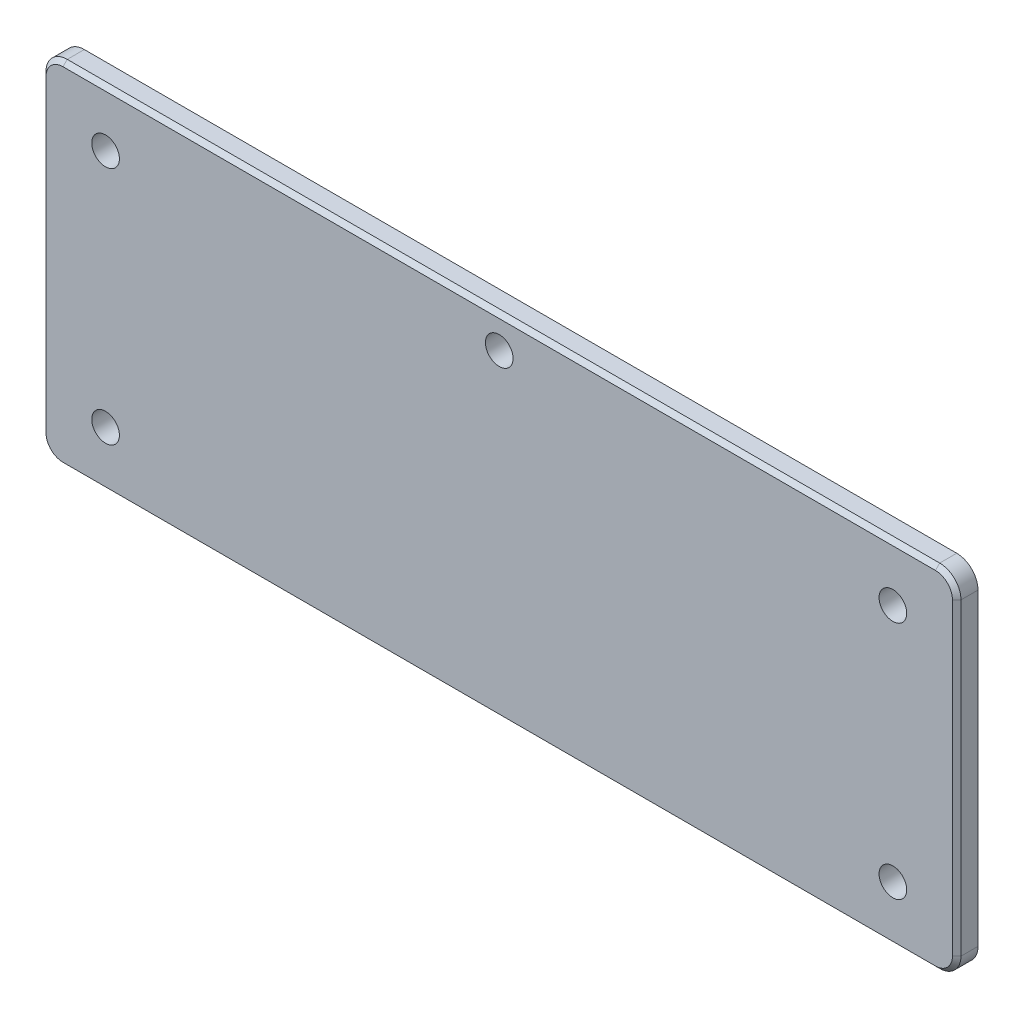
ISO-10303-21;
HEADER;
FILE_DESCRIPTION(('STEP AP214'),'2;1');
FILE_NAME('part.step','',(''),(''),'','','');
FILE_SCHEMA(('AUTOMOTIVE_DESIGN { 1 0 10303 214 1 1 1 1 }'));
ENDSEC;
DATA;
#1=APPLICATION_CONTEXT('core data for automotive mechanical design processes');
#2=APPLICATION_PROTOCOL_DEFINITION('international standard','automotive_design',2000,#1);
#3=PRODUCT_CONTEXT('',#1,'mechanical');
#4=PRODUCT('Part','Part','',(#3));
#5=PRODUCT_RELATED_PRODUCT_CATEGORY('part','',(#4));
#6=PRODUCT_DEFINITION_FORMATION('','',#4);
#7=PRODUCT_DEFINITION_CONTEXT('part definition',#1,'design');
#8=PRODUCT_DEFINITION('design','',#6,#7);
#9=PRODUCT_DEFINITION_SHAPE('','',#8);
#10=(LENGTH_UNIT() NAMED_UNIT(*) SI_UNIT(.MILLI.,.METRE.));
#11=(NAMED_UNIT(*) PLANE_ANGLE_UNIT() SI_UNIT($,.RADIAN.));
#12=(NAMED_UNIT(*) SI_UNIT($,.STERADIAN.) SOLID_ANGLE_UNIT());
#13=UNCERTAINTY_MEASURE_WITH_UNIT(LENGTH_MEASURE(1.E-05),#10,'distance_accuracy_value','');
#14=(GEOMETRIC_REPRESENTATION_CONTEXT(3) GLOBAL_UNCERTAINTY_ASSIGNED_CONTEXT((#13)) GLOBAL_UNIT_ASSIGNED_CONTEXT((#10,
#11,#12)) REPRESENTATION_CONTEXT('',''));
#15=CARTESIAN_POINT('',(0.,0.,0.));
#16=DIRECTION('',(0.,0.,1.));
#17=DIRECTION('',(1.,0.,0.));
#18=AXIS2_PLACEMENT_3D('',#15,#16,#17);
#19=CARTESIAN_POINT('',(-54.61,20.955,2.54));
#20=DIRECTION('',(1.,0.,0.));
#21=DIRECTION('',(0.,1.,0.));
#22=AXIS2_PLACEMENT_3D('',#19,#20,#21);
#23=PLANE('',#22);
#24=DIRECTION('',(0.,0.,-1.));
#25=VECTOR('',#24,1.);
#26=CARTESIAN_POINT('',(-54.61,-18.415,2.54));
#27=LINE('',#26,#25);
#28=CARTESIAN_POINT('',(-54.61,-18.415,0.));
#29=VERTEX_POINT('',#28);
#30=CARTESIAN_POINT('',(-54.61,-18.415,2.03200000000001));
#31=VERTEX_POINT('',#30);
#32=EDGE_CURVE('E172',#29,#31,#27,.F.);
#33=ORIENTED_EDGE('',*,*,#32,.T.);
#34=DIRECTION('',(0.,1.,0.));
#35=VECTOR('',#34,1.);
#36=CARTESIAN_POINT('',(-54.61,18.415,2.03200000000001));
#37=LINE('',#36,#35);
#38=CARTESIAN_POINT('',(-54.61,18.415,2.03200000000001));
#39=VERTEX_POINT('',#38);
#40=EDGE_CURVE('E11',#31,#39,#37,.T.);
#41=ORIENTED_EDGE('',*,*,#40,.T.);
#42=DIRECTION('',(0.,0.,-1.));
#43=VECTOR('',#42,1.);
#44=CARTESIAN_POINT('',(-54.61,18.415,2.54));
#45=LINE('',#44,#43);
#46=CARTESIAN_POINT('',(-54.61,18.415,0.));
#47=VERTEX_POINT('',#46);
#48=EDGE_CURVE('E170',#39,#47,#45,.T.);
#49=ORIENTED_EDGE('',*,*,#48,.T.);
#50=DIRECTION('',(0.,-1.,0.));
#51=VECTOR('',#50,1.);
#52=CARTESIAN_POINT('',(-54.61,20.955,0.));
#53=LINE('',#52,#51);
#54=EDGE_CURVE('E262',#47,#29,#53,.T.);
#55=ORIENTED_EDGE('',*,*,#54,.T.);
#56=EDGE_LOOP('',(#33,#41,#49,#55));
#57=FACE_BOUND('',#56,.T.);
#58=ADVANCED_FACE('F34',(#57),#23,.F.);
#59=CARTESIAN_POINT('',(-54.61,-20.955,2.54));
#60=DIRECTION('',(0.,1.,0.));
#61=DIRECTION('',(0.,0.,1.));
#62=AXIS2_PLACEMENT_3D('',#59,#60,#61);
#63=PLANE('',#62);
#64=DIRECTION('',(0.,0.,-1.));
#65=VECTOR('',#64,1.);
#66=CARTESIAN_POINT('',(52.07,-20.955,2.54));
#67=LINE('',#66,#65);
#68=CARTESIAN_POINT('',(52.07,-20.955,0.));
#69=VERTEX_POINT('',#68);
#70=CARTESIAN_POINT('',(52.07,-20.955,2.03200000000001));
#71=VERTEX_POINT('',#70);
#72=EDGE_CURVE('E167',#69,#71,#67,.F.);
#73=ORIENTED_EDGE('',*,*,#72,.T.);
#74=DIRECTION('',(-1.,0.,0.));
#75=VECTOR('',#74,1.);
#76=CARTESIAN_POINT('',(-52.07,-20.955,2.03200000000001));
#77=LINE('',#76,#75);
#78=CARTESIAN_POINT('',(-52.07,-20.955,2.03200000000001));
#79=VERTEX_POINT('',#78);
#80=EDGE_CURVE('E199',#71,#79,#77,.T.);
#81=ORIENTED_EDGE('',*,*,#80,.T.);
#82=DIRECTION('',(0.,0.,-1.));
#83=VECTOR('',#82,1.);
#84=CARTESIAN_POINT('',(-52.07,-20.955,2.54));
#85=LINE('',#84,#83);
#86=CARTESIAN_POINT('',(-52.07,-20.955,0.));
#87=VERTEX_POINT('',#86);
#88=EDGE_CURVE('E165',#79,#87,#85,.T.);
#89=ORIENTED_EDGE('',*,*,#88,.T.);
#90=DIRECTION('',(1.,0.,0.));
#91=VECTOR('',#90,1.);
#92=CARTESIAN_POINT('',(-54.61,-20.955,0.));
#93=LINE('',#92,#91);
#94=EDGE_CURVE('E155',#87,#69,#93,.T.);
#95=ORIENTED_EDGE('',*,*,#94,.T.);
#96=EDGE_LOOP('',(#73,#81,#89,#95));
#97=FACE_BOUND('',#96,.T.);
#98=ADVANCED_FACE('F268',(#97),#63,.F.);
#99=CARTESIAN_POINT('',(54.61,20.955,2.54));
#100=DIRECTION('',(-1.,0.,0.));
#101=DIRECTION('',(0.,0.,1.));
#102=AXIS2_PLACEMENT_3D('',#99,#100,#101);
#103=PLANE('',#102);
#104=DIRECTION('',(0.,0.,-1.));
#105=VECTOR('',#104,1.);
#106=CARTESIAN_POINT('',(54.61,18.415,2.54));
#107=LINE('',#106,#105);
#108=CARTESIAN_POINT('',(54.61,18.415,0.));
#109=VERTEX_POINT('',#108);
#110=CARTESIAN_POINT('',(54.61,18.415,2.03200000000001));
#111=VERTEX_POINT('',#110);
#112=EDGE_CURVE('E142',#109,#111,#107,.F.);
#113=ORIENTED_EDGE('',*,*,#112,.T.);
#114=DIRECTION('',(0.,-1.,0.));
#115=VECTOR('',#114,1.);
#116=CARTESIAN_POINT('',(54.61,-18.415,2.03200000000001));
#117=LINE('',#116,#115);
#118=CARTESIAN_POINT('',(54.61,-18.415,2.03200000000001));
#119=VERTEX_POINT('',#118);
#120=EDGE_CURVE('E191',#111,#119,#117,.T.);
#121=ORIENTED_EDGE('',*,*,#120,.T.);
#122=DIRECTION('',(0.,0.,-1.));
#123=VECTOR('',#122,1.);
#124=CARTESIAN_POINT('',(54.61,-18.415,2.54));
#125=LINE('',#124,#123);
#126=CARTESIAN_POINT('',(54.61,-18.415,0.));
#127=VERTEX_POINT('',#126);
#128=EDGE_CURVE('E146',#119,#127,#125,.T.);
#129=ORIENTED_EDGE('',*,*,#128,.T.);
#130=DIRECTION('',(0.,1.,0.));
#131=VECTOR('',#130,1.);
#132=CARTESIAN_POINT('',(54.61,20.955,0.));
#133=LINE('',#132,#131);
#134=EDGE_CURVE('E152',#127,#109,#133,.T.);
#135=ORIENTED_EDGE('',*,*,#134,.T.);
#136=EDGE_LOOP('',(#113,#121,#129,#135));
#137=FACE_BOUND('',#136,.T.);
#138=ADVANCED_FACE('F284',(#137),#103,.F.);
#139=CARTESIAN_POINT('',(-54.61,20.955,2.54));
#140=DIRECTION('',(0.,-1.,0.));
#141=DIRECTION('',(0.,0.,-1.));
#142=AXIS2_PLACEMENT_3D('',#139,#140,#141);
#143=PLANE('',#142);
#144=DIRECTION('',(0.,0.,-1.));
#145=VECTOR('',#144,1.);
#146=CARTESIAN_POINT('',(-52.07,20.955,2.54));
#147=LINE('',#146,#145);
#148=CARTESIAN_POINT('',(-52.07,20.955,0.));
#149=VERTEX_POINT('',#148);
#150=CARTESIAN_POINT('',(-52.07,20.955,2.03200000000001));
#151=VERTEX_POINT('',#150);
#152=EDGE_CURVE('E136',#149,#151,#147,.F.);
#153=ORIENTED_EDGE('',*,*,#152,.T.);
#154=DIRECTION('',(1.,0.,0.));
#155=VECTOR('',#154,1.);
#156=CARTESIAN_POINT('',(52.07,20.955,2.03200000000001));
#157=LINE('',#156,#155);
#158=CARTESIAN_POINT('',(52.07,20.955,2.03200000000001));
#159=VERTEX_POINT('',#158);
#160=EDGE_CURVE('E132',#151,#159,#157,.T.);
#161=ORIENTED_EDGE('',*,*,#160,.T.);
#162=DIRECTION('',(0.,0.,-1.));
#163=VECTOR('',#162,1.);
#164=CARTESIAN_POINT('',(52.07,20.955,2.54));
#165=LINE('',#164,#163);
#166=CARTESIAN_POINT('',(52.07,20.955,0.));
#167=VERTEX_POINT('',#166);
#168=EDGE_CURVE('E124',#159,#167,#165,.T.);
#169=ORIENTED_EDGE('',*,*,#168,.T.);
#170=DIRECTION('',(-1.,0.,0.));
#171=VECTOR('',#170,1.);
#172=CARTESIAN_POINT('',(-54.61,20.955,0.));
#173=LINE('',#172,#171);
#174=EDGE_CURVE('E129',#167,#149,#173,.T.);
#175=ORIENTED_EDGE('',*,*,#174,.T.);
#176=EDGE_LOOP('',(#153,#161,#169,#175));
#177=FACE_BOUND('',#176,.T.);
#178=ADVANCED_FACE('F127',(#177),#143,.F.);
#179=CARTESIAN_POINT('',(0.,0.,2.54));
#180=DIRECTION('',(0.,0.,1.));
#181=DIRECTION('',(1.,0.,0.));
#182=AXIS2_PLACEMENT_3D('',#179,#180,#181);
#183=PLANE('',#182);
#184=CARTESIAN_POINT('',(52.07,-18.415,2.54));
#185=DIRECTION('',(0.,0.,1.));
#186=DIRECTION('',(1.,0.,0.));
#187=AXIS2_PLACEMENT_3D('',#184,#185,#186);
#188=CIRCLE('',#187,2.03199999999999);
#189=CARTESIAN_POINT('',(52.07,-20.447,2.54));
#190=VERTEX_POINT('',#189);
#191=CARTESIAN_POINT('',(54.102,-18.415,2.54));
#192=VERTEX_POINT('',#191);
#193=EDGE_CURVE('E184',#190,#192,#188,.T.);
#194=ORIENTED_EDGE('',*,*,#193,.T.);
#195=DIRECTION('',(0.,1.,0.));
#196=VECTOR('',#195,1.);
#197=CARTESIAN_POINT('',(54.102,18.415,2.54));
#198=LINE('',#197,#196);
#199=CARTESIAN_POINT('',(54.102,18.415,2.54));
#200=VERTEX_POINT('',#199);
#201=EDGE_CURVE('E188',#192,#200,#198,.T.);
#202=ORIENTED_EDGE('',*,*,#201,.T.);
#203=CARTESIAN_POINT('',(52.07,18.415,2.54));
#204=DIRECTION('',(0.,0.,1.));
#205=DIRECTION('',(1.,0.,0.));
#206=AXIS2_PLACEMENT_3D('',#203,#204,#205);
#207=CIRCLE('',#206,2.03199999999999);
#208=CARTESIAN_POINT('',(52.07,20.447,2.54));
#209=VERTEX_POINT('',#208);
#210=EDGE_CURVE('E186',#200,#209,#207,.T.);
#211=ORIENTED_EDGE('',*,*,#210,.T.);
#212=DIRECTION('',(-1.,0.,0.));
#213=VECTOR('',#212,1.);
#214=CARTESIAN_POINT('',(-52.07,20.447,2.54));
#215=LINE('',#214,#213);
#216=CARTESIAN_POINT('',(-52.07,20.447,2.54));
#217=VERTEX_POINT('',#216);
#218=EDGE_CURVE('E182',#209,#217,#215,.T.);
#219=ORIENTED_EDGE('',*,*,#218,.T.);
#220=CARTESIAN_POINT('',(-52.07,18.415,2.54));
#221=DIRECTION('',(0.,0.,1.));
#222=DIRECTION('',(1.,0.,0.));
#223=AXIS2_PLACEMENT_3D('',#220,#221,#222);
#224=CIRCLE('',#223,2.03199999999999);
#225=CARTESIAN_POINT('',(-54.102,18.415,2.54));
#226=VERTEX_POINT('',#225);
#227=EDGE_CURVE('E178',#217,#226,#224,.T.);
#228=ORIENTED_EDGE('',*,*,#227,.T.);
#229=DIRECTION('',(0.,-1.,0.));
#230=VECTOR('',#229,1.);
#231=CARTESIAN_POINT('',(-54.102,-18.415,2.54));
#232=LINE('',#231,#230);
#233=CARTESIAN_POINT('',(-54.102,-18.415,2.54));
#234=VERTEX_POINT('',#233);
#235=EDGE_CURVE('E174',#226,#234,#232,.T.);
#236=ORIENTED_EDGE('',*,*,#235,.T.);
#237=CARTESIAN_POINT('',(-52.07,-18.415,2.54));
#238=DIRECTION('',(0.,0.,1.));
#239=DIRECTION('',(1.,0.,0.));
#240=AXIS2_PLACEMENT_3D('',#237,#238,#239);
#241=CIRCLE('',#240,2.03199999999999);
#242=CARTESIAN_POINT('',(-52.07,-20.447,2.54));
#243=VERTEX_POINT('',#242);
#244=EDGE_CURVE('E176',#234,#243,#241,.T.);
#245=ORIENTED_EDGE('',*,*,#244,.T.);
#246=DIRECTION('',(1.,0.,0.));
#247=VECTOR('',#246,1.);
#248=CARTESIAN_POINT('',(52.07,-20.447,2.54));
#249=LINE('',#248,#247);
#250=EDGE_CURVE('E180',#243,#190,#249,.T.);
#251=ORIENTED_EDGE('',*,*,#250,.T.);
#252=EDGE_LOOP('',(#194,#202,#211,#219,#228,#236,#245,#251));
#253=FACE_BOUND('',#252,.T.);
#254=CARTESIAN_POINT('',(0.,17.145,2.54));
#255=DIRECTION('',(0.,0.,1.));
#256=DIRECTION('',(1.,0.,0.));
#257=AXIS2_PLACEMENT_3D('',#254,#255,#256);
#258=CIRCLE('',#257,1.651);
#259=CARTESIAN_POINT('',(1.651,17.145,2.54));
#260=VERTEX_POINT('',#259);
#261=EDGE_CURVE('E226',#260,#260,#258,.T.);
#262=ORIENTED_EDGE('',*,*,#261,.F.);
#263=EDGE_LOOP('',(#262));
#264=FACE_BOUND('',#263,.T.);
#265=CARTESIAN_POINT('',(46.99,14.2875,2.54));
#266=DIRECTION('',(0.,0.,1.));
#267=DIRECTION('',(1.,0.,0.));
#268=AXIS2_PLACEMENT_3D('',#265,#266,#267);
#269=CIRCLE('',#268,1.651);
#270=CARTESIAN_POINT('',(48.641,14.2875,2.54));
#271=VERTEX_POINT('',#270);
#272=EDGE_CURVE('E259',#271,#271,#269,.T.);
#273=ORIENTED_EDGE('',*,*,#272,.F.);
#274=EDGE_LOOP('',(#273));
#275=FACE_BOUND('',#274,.T.);
#276=CARTESIAN_POINT('',(46.99,-14.2875,2.54));
#277=DIRECTION('',(0.,0.,1.));
#278=DIRECTION('',(1.,0.,0.));
#279=AXIS2_PLACEMENT_3D('',#276,#277,#278);
#280=CIRCLE('',#279,1.651);
#281=CARTESIAN_POINT('',(48.641,-14.2875,2.54));
#282=VERTEX_POINT('',#281);
#283=EDGE_CURVE('E256',#282,#282,#280,.T.);
#284=ORIENTED_EDGE('',*,*,#283,.F.);
#285=EDGE_LOOP('',(#284));
#286=FACE_BOUND('',#285,.T.);
#287=CARTESIAN_POINT('',(-46.99,-14.2875,2.54));
#288=DIRECTION('',(0.,0.,1.));
#289=DIRECTION('',(1.,0.,0.));
#290=AXIS2_PLACEMENT_3D('',#287,#288,#289);
#291=CIRCLE('',#290,1.651);
#292=CARTESIAN_POINT('',(-45.339,-14.2875,2.54));
#293=VERTEX_POINT('',#292);
#294=EDGE_CURVE('E253',#293,#293,#291,.T.);
#295=ORIENTED_EDGE('',*,*,#294,.F.);
#296=EDGE_LOOP('',(#295));
#297=FACE_BOUND('',#296,.T.);
#298=CARTESIAN_POINT('',(-46.99,14.2875,2.54));
#299=DIRECTION('',(0.,0.,1.));
#300=DIRECTION('',(1.,0.,0.));
#301=AXIS2_PLACEMENT_3D('',#298,#299,#300);
#302=CIRCLE('',#301,1.651);
#303=CARTESIAN_POINT('',(-45.339,14.2875,2.54));
#304=VERTEX_POINT('',#303);
#305=EDGE_CURVE('E250',#304,#304,#302,.T.);
#306=ORIENTED_EDGE('',*,*,#305,.F.);
#307=EDGE_LOOP('',(#306));
#308=FACE_BOUND('',#307,.T.);
#309=ADVANCED_FACE('F294',(#253,#264,#275,#286,#297,#308),#183,.T.);
#310=CARTESIAN_POINT('',(0.,0.,0.));
#311=DIRECTION('',(0.,0.,1.));
#312=DIRECTION('',(1.,0.,0.));
#313=AXIS2_PLACEMENT_3D('',#310,#311,#312);
#314=PLANE('',#313);
#315=CARTESIAN_POINT('',(0.,17.145,0.));
#316=DIRECTION('',(0.,0.,1.));
#317=DIRECTION('',(1.,0.,0.));
#318=AXIS2_PLACEMENT_3D('',#315,#316,#317);
#319=CIRCLE('',#318,1.651);
#320=CARTESIAN_POINT('',(1.651,17.145,0.));
#321=VERTEX_POINT('',#320);
#322=EDGE_CURVE('E231',#321,#321,#319,.T.);
#323=ORIENTED_EDGE('',*,*,#322,.T.);
#324=EDGE_LOOP('',(#323));
#325=FACE_BOUND('',#324,.T.);
#326=CARTESIAN_POINT('',(46.99,14.2875,0.));
#327=DIRECTION('',(0.,0.,1.));
#328=DIRECTION('',(1.,0.,0.));
#329=AXIS2_PLACEMENT_3D('',#326,#327,#328);
#330=CIRCLE('',#329,1.651);
#331=CARTESIAN_POINT('',(48.641,14.2875,0.));
#332=VERTEX_POINT('',#331);
#333=EDGE_CURVE('E236',#332,#332,#330,.T.);
#334=ORIENTED_EDGE('',*,*,#333,.T.);
#335=EDGE_LOOP('',(#334));
#336=FACE_BOUND('',#335,.T.);
#337=CARTESIAN_POINT('',(46.99,-14.2875,0.));
#338=DIRECTION('',(0.,0.,1.));
#339=DIRECTION('',(1.,0.,0.));
#340=AXIS2_PLACEMENT_3D('',#337,#338,#339);
#341=CIRCLE('',#340,1.651);
#342=CARTESIAN_POINT('',(48.641,-14.2875,0.));
#343=VERTEX_POINT('',#342);
#344=EDGE_CURVE('E243',#343,#343,#341,.T.);
#345=ORIENTED_EDGE('',*,*,#344,.T.);
#346=EDGE_LOOP('',(#345));
#347=FACE_BOUND('',#346,.T.);
#348=CARTESIAN_POINT('',(-46.99,-14.2875,0.));
#349=DIRECTION('',(0.,0.,1.));
#350=DIRECTION('',(1.,0.,0.));
#351=AXIS2_PLACEMENT_3D('',#348,#349,#350);
#352=CIRCLE('',#351,1.651);
#353=CARTESIAN_POINT('',(-45.339,-14.2875,0.));
#354=VERTEX_POINT('',#353);
#355=EDGE_CURVE('E239',#354,#354,#352,.T.);
#356=ORIENTED_EDGE('',*,*,#355,.T.);
#357=EDGE_LOOP('',(#356));
#358=FACE_BOUND('',#357,.T.);
#359=CARTESIAN_POINT('',(-46.99,14.2875,0.));
#360=DIRECTION('',(0.,0.,1.));
#361=DIRECTION('',(1.,0.,0.));
#362=AXIS2_PLACEMENT_3D('',#359,#360,#361);
#363=CIRCLE('',#362,1.651);
#364=CARTESIAN_POINT('',(-45.339,14.2875,0.));
#365=VERTEX_POINT('',#364);
#366=EDGE_CURVE('E242',#365,#365,#363,.T.);
#367=ORIENTED_EDGE('',*,*,#366,.T.);
#368=EDGE_LOOP('',(#367));
#369=FACE_BOUND('',#368,.T.);
#370=ORIENTED_EDGE('',*,*,#174,.F.);
#371=CARTESIAN_POINT('',(52.07,18.415,0.));
#372=DIRECTION('',(0.,0.,1.));
#373=DIRECTION('',(1.,0.,0.));
#374=AXIS2_PLACEMENT_3D('',#371,#372,#373);
#375=CIRCLE('',#374,2.54);
#376=EDGE_CURVE('E139',#167,#109,#375,.F.);
#377=ORIENTED_EDGE('',*,*,#376,.T.);
#378=ORIENTED_EDGE('',*,*,#134,.F.);
#379=CARTESIAN_POINT('',(52.07,-18.415,0.));
#380=DIRECTION('',(0.,0.,1.));
#381=DIRECTION('',(1.,0.,0.));
#382=AXIS2_PLACEMENT_3D('',#379,#380,#381);
#383=CIRCLE('',#382,2.54);
#384=EDGE_CURVE('E147',#127,#69,#383,.F.);
#385=ORIENTED_EDGE('',*,*,#384,.T.);
#386=ORIENTED_EDGE('',*,*,#94,.F.);
#387=CARTESIAN_POINT('',(-52.07,-18.415,0.));
#388=DIRECTION('',(0.,0.,1.));
#389=DIRECTION('',(1.,0.,0.));
#390=AXIS2_PLACEMENT_3D('',#387,#388,#389);
#391=CIRCLE('',#390,2.54);
#392=EDGE_CURVE('E160',#87,#29,#391,.F.);
#393=ORIENTED_EDGE('',*,*,#392,.T.);
#394=ORIENTED_EDGE('',*,*,#54,.F.);
#395=CARTESIAN_POINT('',(-52.07,18.415,0.));
#396=DIRECTION('',(0.,0.,1.));
#397=DIRECTION('',(1.,0.,0.));
#398=AXIS2_PLACEMENT_3D('',#395,#396,#397);
#399=CIRCLE('',#398,2.54);
#400=EDGE_CURVE('E135',#47,#149,#399,.F.);
#401=ORIENTED_EDGE('',*,*,#400,.T.);
#402=EDGE_LOOP('',(#370,#377,#378,#385,#386,#393,#394,#401));
#403=FACE_BOUND('',#402,.T.);
#404=ADVANCED_FACE('F149',(#325,#336,#347,#358,#369,#403),#314,.F.);
#405=CARTESIAN_POINT('',(-46.99,14.2875,0.));
#406=DIRECTION('',(0.,0.,1.));
#407=DIRECTION('',(1.,0.,0.));
#408=AXIS2_PLACEMENT_3D('',#405,#406,#407);
#409=CYLINDRICAL_SURFACE('',#408,1.651);
#410=ORIENTED_EDGE('',*,*,#305,.T.);
#411=EDGE_LOOP('',(#410));
#412=FACE_BOUND('',#411,.T.);
#413=ORIENTED_EDGE('',*,*,#366,.F.);
#414=EDGE_LOOP('',(#413));
#415=FACE_BOUND('',#414,.T.);
#416=ADVANCED_FACE('F440',(#412,#415),#409,.F.);
#417=CARTESIAN_POINT('',(-46.99,-14.2875,0.));
#418=DIRECTION('',(0.,0.,1.));
#419=DIRECTION('',(1.,0.,0.));
#420=AXIS2_PLACEMENT_3D('',#417,#418,#419);
#421=CYLINDRICAL_SURFACE('',#420,1.651);
#422=ORIENTED_EDGE('',*,*,#294,.T.);
#423=EDGE_LOOP('',(#422));
#424=FACE_BOUND('',#423,.T.);
#425=ORIENTED_EDGE('',*,*,#355,.F.);
#426=EDGE_LOOP('',(#425));
#427=FACE_BOUND('',#426,.T.);
#428=ADVANCED_FACE('F431',(#424,#427),#421,.F.);
#429=CARTESIAN_POINT('',(46.99,-14.2875,0.));
#430=DIRECTION('',(0.,0.,1.));
#431=DIRECTION('',(1.,0.,0.));
#432=AXIS2_PLACEMENT_3D('',#429,#430,#431);
#433=CYLINDRICAL_SURFACE('',#432,1.651);
#434=ORIENTED_EDGE('',*,*,#283,.T.);
#435=EDGE_LOOP('',(#434));
#436=FACE_BOUND('',#435,.T.);
#437=ORIENTED_EDGE('',*,*,#344,.F.);
#438=EDGE_LOOP('',(#437));
#439=FACE_BOUND('',#438,.T.);
#440=ADVANCED_FACE('F422',(#436,#439),#433,.F.);
#441=CARTESIAN_POINT('',(46.99,14.2875,0.));
#442=DIRECTION('',(0.,0.,1.));
#443=DIRECTION('',(1.,0.,0.));
#444=AXIS2_PLACEMENT_3D('',#441,#442,#443);
#445=CYLINDRICAL_SURFACE('',#444,1.651);
#446=ORIENTED_EDGE('',*,*,#272,.T.);
#447=EDGE_LOOP('',(#446));
#448=FACE_BOUND('',#447,.T.);
#449=ORIENTED_EDGE('',*,*,#333,.F.);
#450=EDGE_LOOP('',(#449));
#451=FACE_BOUND('',#450,.T.);
#452=ADVANCED_FACE('F321',(#448,#451),#445,.F.);
#453=CARTESIAN_POINT('',(52.07,18.415,2.54));
#454=DIRECTION('',(0.,0.,-1.));
#455=DIRECTION('',(-1.,0.,0.));
#456=AXIS2_PLACEMENT_3D('',#453,#454,#455);
#457=CYLINDRICAL_SURFACE('',#456,2.54);
#458=ORIENTED_EDGE('',*,*,#168,.F.);
#459=CARTESIAN_POINT('',(52.07,18.415,2.03200000000001));
#460=DIRECTION('',(0.,0.,1.));
#461=DIRECTION('',(1.,0.,0.));
#462=AXIS2_PLACEMENT_3D('',#459,#460,#461);
#463=CIRCLE('',#462,2.54);
#464=EDGE_CURVE('E194',#159,#111,#463,.F.);
#465=ORIENTED_EDGE('',*,*,#464,.T.);
#466=ORIENTED_EDGE('',*,*,#112,.F.);
#467=ORIENTED_EDGE('',*,*,#376,.F.);
#468=EDGE_LOOP('',(#458,#465,#466,#467));
#469=FACE_BOUND('',#468,.T.);
#470=ADVANCED_FACE('F140',(#469),#457,.T.);
#471=CARTESIAN_POINT('',(52.07,-18.415,2.54));
#472=DIRECTION('',(0.,0.,-1.));
#473=DIRECTION('',(-1.,0.,0.));
#474=AXIS2_PLACEMENT_3D('',#471,#472,#473);
#475=CYLINDRICAL_SURFACE('',#474,2.54);
#476=ORIENTED_EDGE('',*,*,#128,.F.);
#477=CARTESIAN_POINT('',(52.07,-18.415,2.03200000000001));
#478=DIRECTION('',(0.,0.,1.));
#479=DIRECTION('',(1.,0.,0.));
#480=AXIS2_PLACEMENT_3D('',#477,#478,#479);
#481=CIRCLE('',#480,2.54);
#482=EDGE_CURVE('E196',#119,#71,#481,.F.);
#483=ORIENTED_EDGE('',*,*,#482,.T.);
#484=ORIENTED_EDGE('',*,*,#72,.F.);
#485=ORIENTED_EDGE('',*,*,#384,.F.);
#486=EDGE_LOOP('',(#476,#483,#484,#485));
#487=FACE_BOUND('',#486,.T.);
#488=ADVANCED_FACE('F274',(#487),#475,.T.);
#489=CARTESIAN_POINT('',(-52.07,-18.415,2.54));
#490=DIRECTION('',(0.,0.,-1.));
#491=DIRECTION('',(-1.,0.,0.));
#492=AXIS2_PLACEMENT_3D('',#489,#490,#491);
#493=CYLINDRICAL_SURFACE('',#492,2.54);
#494=ORIENTED_EDGE('',*,*,#88,.F.);
#495=CARTESIAN_POINT('',(-52.07,-18.415,2.03200000000001));
#496=DIRECTION('',(0.,0.,1.));
#497=DIRECTION('',(1.,0.,0.));
#498=AXIS2_PLACEMENT_3D('',#495,#496,#497);
#499=CIRCLE('',#498,2.54);
#500=EDGE_CURVE('E43',#79,#31,#499,.F.);
#501=ORIENTED_EDGE('',*,*,#500,.T.);
#502=ORIENTED_EDGE('',*,*,#32,.F.);
#503=ORIENTED_EDGE('',*,*,#392,.F.);
#504=EDGE_LOOP('',(#494,#501,#502,#503));
#505=FACE_BOUND('',#504,.T.);
#506=ADVANCED_FACE('F300',(#505),#493,.T.);
#507=CARTESIAN_POINT('',(-52.07,18.415,2.54));
#508=DIRECTION('',(0.,0.,-1.));
#509=DIRECTION('',(-1.,0.,0.));
#510=AXIS2_PLACEMENT_3D('',#507,#508,#509);
#511=CYLINDRICAL_SURFACE('',#510,2.54);
#512=ORIENTED_EDGE('',*,*,#48,.F.);
#513=CARTESIAN_POINT('',(-52.07,18.415,2.03200000000001));
#514=DIRECTION('',(0.,0.,1.));
#515=DIRECTION('',(1.,0.,0.));
#516=AXIS2_PLACEMENT_3D('',#513,#514,#515);
#517=CIRCLE('',#516,2.54);
#518=EDGE_CURVE('E201',#39,#151,#517,.F.);
#519=ORIENTED_EDGE('',*,*,#518,.T.);
#520=ORIENTED_EDGE('',*,*,#152,.F.);
#521=ORIENTED_EDGE('',*,*,#400,.F.);
#522=EDGE_LOOP('',(#512,#519,#520,#521));
#523=FACE_BOUND('',#522,.T.);
#524=ADVANCED_FACE('F326',(#523),#511,.T.);
#525=CARTESIAN_POINT('',(0.,17.145,0.));
#526=DIRECTION('',(0.,0.,1.));
#527=DIRECTION('',(1.,0.,0.));
#528=AXIS2_PLACEMENT_3D('',#525,#526,#527);
#529=CYLINDRICAL_SURFACE('',#528,1.651);
#530=ORIENTED_EDGE('',*,*,#322,.F.);
#531=EDGE_LOOP('',(#530));
#532=FACE_BOUND('',#531,.T.);
#533=ORIENTED_EDGE('',*,*,#261,.T.);
#534=EDGE_LOOP('',(#533));
#535=FACE_BOUND('',#534,.T.);
#536=ADVANCED_FACE('F309',(#532,#535),#529,.F.);
#537=CARTESIAN_POINT('',(-54.102,0.,2.54));
#538=DIRECTION('',(-0.70710678118654,0.,0.707106781186555));
#539=DIRECTION('',(0.,1.,0.));
#540=AXIS2_PLACEMENT_3D('',#537,#538,#539);
#541=PLANE('',#540);
#542=DIRECTION('',(0.707106781186552,0.,0.707106781186543));
#543=VECTOR('',#542,1.);
#544=CARTESIAN_POINT('',(-54.61,18.415,2.03200000000001));
#545=LINE('',#544,#543);
#546=EDGE_CURVE('E219',#39,#226,#545,.T.);
#547=ORIENTED_EDGE('',*,*,#546,.F.);
#548=ORIENTED_EDGE('',*,*,#40,.F.);
#549=DIRECTION('',(-0.707106781186552,0.,-0.707106781186543));
#550=VECTOR('',#549,1.);
#551=CARTESIAN_POINT('',(-54.102,-18.415,2.54));
#552=LINE('',#551,#550);
#553=EDGE_CURVE('E38',#234,#31,#552,.T.);
#554=ORIENTED_EDGE('',*,*,#553,.F.);
#555=ORIENTED_EDGE('',*,*,#235,.F.);
#556=EDGE_LOOP('',(#547,#548,#554,#555));
#557=FACE_BOUND('',#556,.T.);
#558=ADVANCED_FACE('F36',(#557),#541,.T.);
#559=CARTESIAN_POINT('',(-52.07,-18.415,2.54));
#560=DIRECTION('',(0.,0.,-1.));
#561=DIRECTION('',(-1.,0.,0.));
#562=AXIS2_PLACEMENT_3D('',#559,#560,#561);
#563=CONICAL_SURFACE('',#562,2.03199999999999,0.785398163397462);
#564=ORIENTED_EDGE('',*,*,#553,.T.);
#565=ORIENTED_EDGE('',*,*,#500,.F.);
#566=DIRECTION('',(0.,-0.707106781186557,-0.707106781186538));
#567=VECTOR('',#566,1.);
#568=CARTESIAN_POINT('',(-52.07,-20.447,2.54));
#569=LINE('',#568,#567);
#570=EDGE_CURVE('E217',#243,#79,#569,.T.);
#571=ORIENTED_EDGE('',*,*,#570,.F.);
#572=ORIENTED_EDGE('',*,*,#244,.F.);
#573=EDGE_LOOP('',(#564,#565,#571,#572));
#574=FACE_BOUND('',#573,.T.);
#575=ADVANCED_FACE('F301',(#574),#563,.T.);
#576=CARTESIAN_POINT('',(-52.07,18.415,2.54));
#577=DIRECTION('',(0.,0.,-1.));
#578=DIRECTION('',(-1.,0.,0.));
#579=AXIS2_PLACEMENT_3D('',#576,#577,#578);
#580=CONICAL_SURFACE('',#579,2.03199999999999,0.785398163397462);
#581=ORIENTED_EDGE('',*,*,#546,.T.);
#582=ORIENTED_EDGE('',*,*,#227,.F.);
#583=DIRECTION('',(0.,-0.707106781186557,0.707106781186538));
#584=VECTOR('',#583,1.);
#585=CARTESIAN_POINT('',(-52.07,20.955,2.03200000000001));
#586=LINE('',#585,#584);
#587=EDGE_CURVE('E214',#151,#217,#586,.T.);
#588=ORIENTED_EDGE('',*,*,#587,.F.);
#589=ORIENTED_EDGE('',*,*,#518,.F.);
#590=EDGE_LOOP('',(#581,#582,#588,#589));
#591=FACE_BOUND('',#590,.T.);
#592=ADVANCED_FACE('F303',(#591),#580,.T.);
#593=CARTESIAN_POINT('',(0.,-20.447,2.54));
#594=DIRECTION('',(0.,-0.707106781186538,0.707106781186557));
#595=DIRECTION('',(-1.,0.,0.));
#596=AXIS2_PLACEMENT_3D('',#593,#594,#595);
#597=PLANE('',#596);
#598=ORIENTED_EDGE('',*,*,#570,.T.);
#599=ORIENTED_EDGE('',*,*,#80,.F.);
#600=DIRECTION('',(0.,-0.707106781186557,-0.707106781186538));
#601=VECTOR('',#600,1.);
#602=CARTESIAN_POINT('',(52.07,-20.447,2.54));
#603=LINE('',#602,#601);
#604=EDGE_CURVE('E211',#190,#71,#603,.T.);
#605=ORIENTED_EDGE('',*,*,#604,.F.);
#606=ORIENTED_EDGE('',*,*,#250,.F.);
#607=EDGE_LOOP('',(#598,#599,#605,#606));
#608=FACE_BOUND('',#607,.T.);
#609=ADVANCED_FACE('F299',(#608),#597,.T.);
#610=CARTESIAN_POINT('',(0.,20.447,2.54));
#611=DIRECTION('',(0.,0.707106781186538,0.707106781186557));
#612=DIRECTION('',(1.,0.,0.));
#613=AXIS2_PLACEMENT_3D('',#610,#611,#612);
#614=PLANE('',#613);
#615=ORIENTED_EDGE('',*,*,#587,.T.);
#616=ORIENTED_EDGE('',*,*,#218,.F.);
#617=DIRECTION('',(0.,-0.707106781186557,0.707106781186538));
#618=VECTOR('',#617,1.);
#619=CARTESIAN_POINT('',(52.07,20.955,2.03200000000001));
#620=LINE('',#619,#618);
#621=EDGE_CURVE('E208',#159,#209,#620,.T.);
#622=ORIENTED_EDGE('',*,*,#621,.F.);
#623=ORIENTED_EDGE('',*,*,#160,.F.);
#624=EDGE_LOOP('',(#615,#616,#622,#623));
#625=FACE_BOUND('',#624,.T.);
#626=ADVANCED_FACE('F336',(#625),#614,.T.);
#627=CARTESIAN_POINT('',(52.07,-18.415,2.54));
#628=DIRECTION('',(0.,0.,-1.));
#629=DIRECTION('',(-1.,0.,0.));
#630=AXIS2_PLACEMENT_3D('',#627,#628,#629);
#631=CONICAL_SURFACE('',#630,2.03199999999999,0.785398163397462);
#632=ORIENTED_EDGE('',*,*,#604,.T.);
#633=ORIENTED_EDGE('',*,*,#482,.F.);
#634=DIRECTION('',(0.707106781186557,0.,-0.707106781186538));
#635=VECTOR('',#634,1.);
#636=CARTESIAN_POINT('',(54.102,-18.415,2.54));
#637=LINE('',#636,#635);
#638=EDGE_CURVE('E206',#192,#119,#637,.T.);
#639=ORIENTED_EDGE('',*,*,#638,.F.);
#640=ORIENTED_EDGE('',*,*,#193,.F.);
#641=EDGE_LOOP('',(#632,#633,#639,#640));
#642=FACE_BOUND('',#641,.T.);
#643=ADVANCED_FACE('F278',(#642),#631,.T.);
#644=CARTESIAN_POINT('',(52.07,18.415,2.54));
#645=DIRECTION('',(0.,0.,-1.));
#646=DIRECTION('',(-1.,0.,0.));
#647=AXIS2_PLACEMENT_3D('',#644,#645,#646);
#648=CONICAL_SURFACE('',#647,2.03199999999999,0.785398163397462);
#649=ORIENTED_EDGE('',*,*,#621,.T.);
#650=ORIENTED_EDGE('',*,*,#210,.F.);
#651=DIRECTION('',(-0.707106781186557,0.,0.707106781186538));
#652=VECTOR('',#651,1.);
#653=CARTESIAN_POINT('',(54.61,18.415,2.03200000000001));
#654=LINE('',#653,#652);
#655=EDGE_CURVE('E204',#111,#200,#654,.T.);
#656=ORIENTED_EDGE('',*,*,#655,.F.);
#657=ORIENTED_EDGE('',*,*,#464,.F.);
#658=EDGE_LOOP('',(#649,#650,#656,#657));
#659=FACE_BOUND('',#658,.T.);
#660=ADVANCED_FACE('F291',(#659),#648,.T.);
#661=CARTESIAN_POINT('',(54.102,0.,2.54));
#662=DIRECTION('',(0.707106781186538,0.,0.707106781186557));
#663=DIRECTION('',(0.,-1.,0.));
#664=AXIS2_PLACEMENT_3D('',#661,#662,#663);
#665=PLANE('',#664);
#666=ORIENTED_EDGE('',*,*,#638,.T.);
#667=ORIENTED_EDGE('',*,*,#120,.F.);
#668=ORIENTED_EDGE('',*,*,#655,.T.);
#669=ORIENTED_EDGE('',*,*,#201,.F.);
#670=EDGE_LOOP('',(#666,#667,#668,#669));
#671=FACE_BOUND('',#670,.T.);
#672=ADVANCED_FACE('F287',(#671),#665,.T.);
#673=CLOSED_SHELL('',(#58,#98,#138,#178,#309,#404,#416,#428,#440,#452,#470,#488,#506,#524,#536,
#558,#575,#592,#609,#626,#643,#660,#672));
#674=MANIFOLD_SOLID_BREP('B2',#673);
#675=ADVANCED_BREP_SHAPE_REPRESENTATION('',(#18,#674),#14);
#676=SHAPE_DEFINITION_REPRESENTATION(#9,#675);
ENDSEC;
END-ISO-10303-21;
